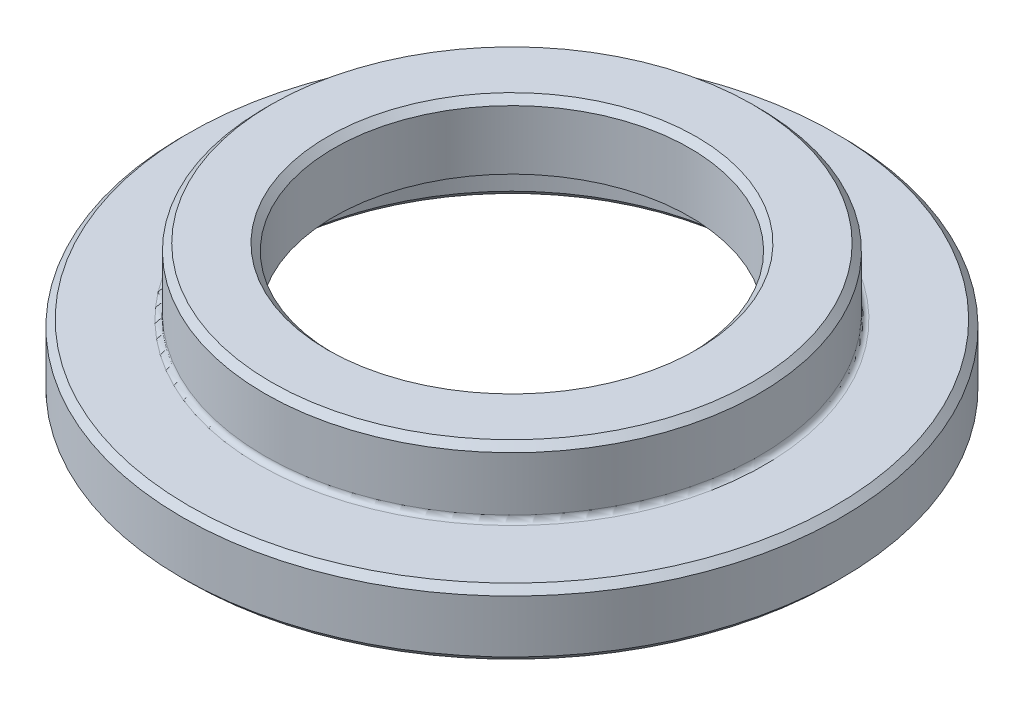
ISO-10303-21;
HEADER;
FILE_DESCRIPTION(('STEP AP214'),'2;1');
FILE_NAME('part.step','',(''),(''),'','','');
FILE_SCHEMA(('AUTOMOTIVE_DESIGN { 1 0 10303 214 1 1 1 1 }'));
ENDSEC;
DATA;
#1=APPLICATION_CONTEXT('core data for automotive mechanical design processes');
#2=APPLICATION_PROTOCOL_DEFINITION('international standard','automotive_design',2000,#1);
#3=PRODUCT_CONTEXT('',#1,'mechanical');
#4=PRODUCT('Part','Part','',(#3));
#5=PRODUCT_RELATED_PRODUCT_CATEGORY('part','',(#4));
#6=PRODUCT_DEFINITION_FORMATION('','',#4);
#7=PRODUCT_DEFINITION_CONTEXT('part definition',#1,'design');
#8=PRODUCT_DEFINITION('design','',#6,#7);
#9=PRODUCT_DEFINITION_SHAPE('','',#8);
#10=(LENGTH_UNIT() NAMED_UNIT(*) SI_UNIT(.MILLI.,.METRE.));
#11=(NAMED_UNIT(*) PLANE_ANGLE_UNIT() SI_UNIT($,.RADIAN.));
#12=(NAMED_UNIT(*) SI_UNIT($,.STERADIAN.) SOLID_ANGLE_UNIT());
#13=UNCERTAINTY_MEASURE_WITH_UNIT(LENGTH_MEASURE(1.E-05),#10,'distance_accuracy_value','');
#14=(GEOMETRIC_REPRESENTATION_CONTEXT(3) GLOBAL_UNCERTAINTY_ASSIGNED_CONTEXT((#13)) GLOBAL_UNIT_ASSIGNED_CONTEXT((#10,
#11,#12)) REPRESENTATION_CONTEXT('',''));
#15=CARTESIAN_POINT('',(0.,0.,0.));
#16=DIRECTION('',(0.,0.,1.));
#17=DIRECTION('',(1.,0.,0.));
#18=AXIS2_PLACEMENT_3D('',#15,#16,#17);
#19=CARTESIAN_POINT('',(0.,2.54,0.));
#20=DIRECTION('',(0.,-1.,0.));
#21=DIRECTION('',(0.,0.,-1.));
#22=AXIS2_PLACEMENT_3D('',#19,#20,#21);
#23=CYLINDRICAL_SURFACE('',#22,9.2837);
#24=CARTESIAN_POINT('',(0.,0.254000000000009,0.));
#25=DIRECTION('',(0.,1.,0.));
#26=DIRECTION('',(0.,0.,1.));
#27=AXIS2_PLACEMENT_3D('',#24,#25,#26);
#28=CIRCLE('',#27,9.2837);
#29=CARTESIAN_POINT('',(0.,0.254000000000009,9.2837));
#30=VERTEX_POINT('',#29);
#31=EDGE_CURVE('E82',#30,#30,#28,.F.);
#32=ORIENTED_EDGE('',*,*,#31,.T.);
#33=EDGE_LOOP('',(#32));
#34=FACE_BOUND('',#33,.T.);
#35=CARTESIAN_POINT('',(0.,2.3368,0.));
#36=DIRECTION('',(0.,1.,0.));
#37=DIRECTION('',(0.,0.,1.));
#38=AXIS2_PLACEMENT_3D('',#35,#36,#37);
#39=CIRCLE('',#38,9.2837);
#40=CARTESIAN_POINT('',(0.,2.3368,9.2837));
#41=VERTEX_POINT('',#40);
#42=EDGE_CURVE('E114',#41,#41,#39,.T.);
#43=ORIENTED_EDGE('',*,*,#42,.T.);
#44=EDGE_LOOP('',(#43));
#45=FACE_BOUND('',#44,.T.);
#46=ADVANCED_FACE('F53',(#34,#45),#23,.F.);
#47=CARTESIAN_POINT('',(0.,2.54,0.));
#48=DIRECTION('',(0.,-1.,0.));
#49=DIRECTION('',(0.,0.,-1.));
#50=AXIS2_PLACEMENT_3D('',#47,#48,#49);
#51=CYLINDRICAL_SURFACE('',#50,12.7);
#52=CARTESIAN_POINT('',(0.,0.254000000000001,0.));
#53=DIRECTION('',(0.,1.,0.));
#54=DIRECTION('',(0.,0.,1.));
#55=AXIS2_PLACEMENT_3D('',#52,#53,#54);
#56=CIRCLE('',#55,12.7);
#57=CARTESIAN_POINT('',(0.,0.254000000000001,12.7));
#58=VERTEX_POINT('',#57);
#59=EDGE_CURVE('E94',#58,#58,#56,.T.);
#60=ORIENTED_EDGE('',*,*,#59,.T.);
#61=EDGE_LOOP('',(#60));
#62=FACE_BOUND('',#61,.T.);
#63=CARTESIAN_POINT('',(0.,2.286,0.));
#64=DIRECTION('',(0.,1.,0.));
#65=DIRECTION('',(0.,0.,1.));
#66=AXIS2_PLACEMENT_3D('',#63,#64,#65);
#67=CIRCLE('',#66,12.7);
#68=CARTESIAN_POINT('',(0.,2.286,12.7));
#69=VERTEX_POINT('',#68);
#70=EDGE_CURVE('E98',#69,#69,#67,.F.);
#71=ORIENTED_EDGE('',*,*,#70,.T.);
#72=EDGE_LOOP('',(#71));
#73=FACE_BOUND('',#72,.T.);
#74=ADVANCED_FACE('F143',(#62,#73),#51,.T.);
#75=CARTESIAN_POINT('',(0.,2.54,0.));
#76=DIRECTION('',(0.,1.,0.));
#77=DIRECTION('',(0.,0.,1.));
#78=AXIS2_PLACEMENT_3D('',#75,#76,#77);
#79=PLANE('',#78);
#80=CARTESIAN_POINT('',(0.,2.54,0.));
#81=DIRECTION('',(0.,1.,0.));
#82=DIRECTION('',(0.,0.,1.));
#83=AXIS2_PLACEMENT_3D('',#80,#81,#82);
#84=CIRCLE('',#83,12.446);
#85=CARTESIAN_POINT('',(0.,2.54,12.446));
#86=VERTEX_POINT('',#85);
#87=EDGE_CURVE('E11',#86,#86,#84,.T.);
#88=ORIENTED_EDGE('',*,*,#87,.T.);
#89=EDGE_LOOP('',(#88));
#90=FACE_BOUND('',#89,.T.);
#91=CARTESIAN_POINT('',(0.,2.54,0.));
#92=DIRECTION('',(0.,1.,0.));
#93=DIRECTION('',(0.,0.,1.));
#94=AXIS2_PLACEMENT_3D('',#91,#92,#93);
#95=CIRCLE('',#94,9.7282);
#96=CARTESIAN_POINT('',(0.,2.54,9.7282));
#97=VERTEX_POINT('',#96);
#98=EDGE_CURVE('E102',#97,#97,#95,.F.);
#99=ORIENTED_EDGE('',*,*,#98,.T.);
#100=EDGE_LOOP('',(#99));
#101=FACE_BOUND('',#100,.T.);
#102=ADVANCED_FACE('F150',(#90,#101),#79,.T.);
#103=CARTESIAN_POINT('',(0.,0.,0.));
#104=DIRECTION('',(0.,1.,0.));
#105=DIRECTION('',(0.,0.,1.));
#106=AXIS2_PLACEMENT_3D('',#103,#104,#105);
#107=PLANE('',#106);
#108=CARTESIAN_POINT('',(0.,0.,0.));
#109=DIRECTION('',(0.,1.,0.));
#110=DIRECTION('',(0.,0.,1.));
#111=AXIS2_PLACEMENT_3D('',#108,#109,#110);
#112=CIRCLE('',#111,12.446);
#113=CARTESIAN_POINT('',(0.,0.,12.446));
#114=VERTEX_POINT('',#113);
#115=EDGE_CURVE('E86',#114,#114,#112,.F.);
#116=ORIENTED_EDGE('',*,*,#115,.T.);
#117=EDGE_LOOP('',(#116));
#118=FACE_BOUND('',#117,.T.);
#119=CARTESIAN_POINT('',(0.,0.,0.));
#120=DIRECTION('',(0.,1.,0.));
#121=DIRECTION('',(0.,0.,1.));
#122=AXIS2_PLACEMENT_3D('',#119,#120,#121);
#123=CIRCLE('',#122,9.5377);
#124=CARTESIAN_POINT('',(0.,0.,9.5377));
#125=VERTEX_POINT('',#124);
#126=EDGE_CURVE('E90',#125,#125,#123,.T.);
#127=ORIENTED_EDGE('',*,*,#126,.T.);
#128=EDGE_LOOP('',(#127));
#129=FACE_BOUND('',#128,.T.);
#130=ADVANCED_FACE('F198',(#118,#129),#107,.F.);
#131=CARTESIAN_POINT('',(0.,2.54,0.));
#132=DIRECTION('',(0.,1.,0.));
#133=DIRECTION('',(0.,0.,1.));
#134=AXIS2_PLACEMENT_3D('',#131,#132,#133);
#135=PLANE('',#134);
#136=CARTESIAN_POINT('',(0.,2.54,0.));
#137=DIRECTION('',(0.,1.,0.));
#138=DIRECTION('',(0.,0.,1.));
#139=AXIS2_PLACEMENT_3D('',#136,#137,#138);
#140=CIRCLE('',#139,9.0805);
#141=CARTESIAN_POINT('',(0.,2.54,9.0805));
#142=VERTEX_POINT('',#141);
#143=EDGE_CURVE('E110',#142,#142,#140,.F.);
#144=ORIENTED_EDGE('',*,*,#143,.T.);
#145=EDGE_LOOP('',(#144));
#146=FACE_BOUND('',#145,.T.);
#147=CARTESIAN_POINT('',(0.,2.54,0.));
#148=DIRECTION('',(0.,1.,0.));
#149=DIRECTION('',(0.,0.,1.));
#150=AXIS2_PLACEMENT_3D('',#147,#148,#149);
#151=CIRCLE('',#150,6.858);
#152=CARTESIAN_POINT('',(0.,2.54,6.858));
#153=VERTEX_POINT('',#152);
#154=EDGE_CURVE('E118',#153,#153,#151,.T.);
#155=ORIENTED_EDGE('',*,*,#154,.T.);
#156=EDGE_LOOP('',(#155));
#157=FACE_BOUND('',#156,.T.);
#158=ADVANCED_FACE('F123',(#146,#157),#135,.F.);
#159=CARTESIAN_POINT('',(0.,5.08,0.));
#160=DIRECTION('',(0.,1.,0.));
#161=DIRECTION('',(0.,0.,1.));
#162=AXIS2_PLACEMENT_3D('',#159,#160,#161);
#163=PLANE('',#162);
#164=CARTESIAN_POINT('',(0.,5.08,0.));
#165=DIRECTION('',(0.,1.,0.));
#166=DIRECTION('',(0.,0.,1.));
#167=AXIS2_PLACEMENT_3D('',#164,#165,#166);
#168=CIRCLE('',#167,7.112);
#169=CARTESIAN_POINT('',(0.,5.08,7.112));
#170=VERTEX_POINT('',#169);
#171=EDGE_CURVE('E67',#170,#170,#168,.F.);
#172=ORIENTED_EDGE('',*,*,#171,.T.);
#173=EDGE_LOOP('',(#172));
#174=FACE_BOUND('',#173,.T.);
#175=CARTESIAN_POINT('',(0.,5.08,0.));
#176=DIRECTION('',(0.,1.,0.));
#177=DIRECTION('',(0.,0.,1.));
#178=AXIS2_PLACEMENT_3D('',#175,#176,#177);
#179=CIRCLE('',#178,9.271);
#180=CARTESIAN_POINT('',(0.,5.08,9.271));
#181=VERTEX_POINT('',#180);
#182=EDGE_CURVE('E72',#181,#181,#179,.T.);
#183=ORIENTED_EDGE('',*,*,#182,.T.);
#184=EDGE_LOOP('',(#183));
#185=FACE_BOUND('',#184,.T.);
#186=ADVANCED_FACE('F139',(#174,#185),#163,.T.);
#187=CARTESIAN_POINT('',(0.,5.08,0.));
#188=DIRECTION('',(0.,-1.,0.));
#189=DIRECTION('',(0.,0.,-1.));
#190=AXIS2_PLACEMENT_3D('',#187,#188,#189);
#191=CYLINDRICAL_SURFACE('',#190,9.525);
#192=CARTESIAN_POINT('',(0.,4.82599999999999,0.));
#193=DIRECTION('',(0.,1.,0.));
#194=DIRECTION('',(0.,0.,1.));
#195=AXIS2_PLACEMENT_3D('',#192,#193,#194);
#196=CIRCLE('',#195,9.525);
#197=CARTESIAN_POINT('',(0.,4.82599999999999,9.525));
#198=VERTEX_POINT('',#197);
#199=EDGE_CURVE('E62',#198,#198,#196,.F.);
#200=ORIENTED_EDGE('',*,*,#199,.T.);
#201=EDGE_LOOP('',(#200));
#202=FACE_BOUND('',#201,.T.);
#203=CARTESIAN_POINT('',(0.,2.7432,0.));
#204=DIRECTION('',(0.,1.,0.));
#205=DIRECTION('',(0.,0.,1.));
#206=AXIS2_PLACEMENT_3D('',#203,#204,#205);
#207=CIRCLE('',#206,9.525);
#208=CARTESIAN_POINT('',(0.,2.7432,9.525));
#209=VERTEX_POINT('',#208);
#210=EDGE_CURVE('E106',#209,#209,#207,.T.);
#211=ORIENTED_EDGE('',*,*,#210,.T.);
#212=EDGE_LOOP('',(#211));
#213=FACE_BOUND('',#212,.T.);
#214=ADVANCED_FACE('F128',(#202,#213),#191,.T.);
#215=CARTESIAN_POINT('',(0.,5.08,0.));
#216=DIRECTION('',(0.,-1.,0.));
#217=DIRECTION('',(0.,0.,-1.));
#218=AXIS2_PLACEMENT_3D('',#215,#216,#217);
#219=CYLINDRICAL_SURFACE('',#218,6.858);
#220=CARTESIAN_POINT('',(0.,4.826,0.));
#221=DIRECTION('',(0.,1.,0.));
#222=DIRECTION('',(0.,0.,1.));
#223=AXIS2_PLACEMENT_3D('',#220,#221,#222);
#224=CIRCLE('',#223,6.858);
#225=CARTESIAN_POINT('',(0.,4.826,6.858));
#226=VERTEX_POINT('',#225);
#227=EDGE_CURVE('E78',#226,#226,#224,.T.);
#228=ORIENTED_EDGE('',*,*,#227,.T.);
#229=EDGE_LOOP('',(#228));
#230=FACE_BOUND('',#229,.T.);
#231=ORIENTED_EDGE('',*,*,#154,.F.);
#232=EDGE_LOOP('',(#231));
#233=FACE_BOUND('',#232,.T.);
#234=ADVANCED_FACE('F125',(#230,#233),#219,.F.);
#235=CARTESIAN_POINT('',(0.,2.3368,0.));
#236=DIRECTION('',(0.,1.,0.));
#237=DIRECTION('',(0.,0.,1.));
#238=AXIS2_PLACEMENT_3D('',#235,#236,#237);
#239=TOROIDAL_SURFACE('',#238,9.0805,0.2032);
#240=ORIENTED_EDGE('',*,*,#143,.F.);
#241=EDGE_LOOP('',(#240));
#242=FACE_BOUND('',#241,.T.);
#243=ORIENTED_EDGE('',*,*,#42,.F.);
#244=EDGE_LOOP('',(#243));
#245=FACE_BOUND('',#244,.T.);
#246=ADVANCED_FACE('F127',(#242,#245),#239,.F.);
#247=CARTESIAN_POINT('',(0.,2.7432,0.));
#248=DIRECTION('',(0.,1.,0.));
#249=DIRECTION('',(0.,0.,1.));
#250=AXIS2_PLACEMENT_3D('',#247,#248,#249);
#251=TOROIDAL_SURFACE('',#250,9.7282,0.2032);
#252=ORIENTED_EDGE('',*,*,#98,.F.);
#253=EDGE_LOOP('',(#252));
#254=FACE_BOUND('',#253,.T.);
#255=ORIENTED_EDGE('',*,*,#210,.F.);
#256=EDGE_LOOP('',(#255));
#257=FACE_BOUND('',#256,.T.);
#258=ADVANCED_FACE('F136',(#254,#257),#251,.F.);
#259=CARTESIAN_POINT('',(0.,0.254000000000001,0.));
#260=DIRECTION('',(0.,1.,0.));
#261=DIRECTION('',(0.,0.,1.));
#262=AXIS2_PLACEMENT_3D('',#259,#260,#261);
#263=CONICAL_SURFACE('',#262,12.7,0.785398163397445);
#264=ORIENTED_EDGE('',*,*,#115,.F.);
#265=EDGE_LOOP('',(#264));
#266=FACE_BOUND('',#265,.T.);
#267=ORIENTED_EDGE('',*,*,#59,.F.);
#268=EDGE_LOOP('',(#267));
#269=FACE_BOUND('',#268,.T.);
#270=ADVANCED_FACE('F158',(#266,#269),#263,.T.);
#271=CARTESIAN_POINT('',(0.,0.,0.));
#272=DIRECTION('',(0.,-1.,0.));
#273=DIRECTION('',(0.,0.,-1.));
#274=AXIS2_PLACEMENT_3D('',#271,#272,#273);
#275=CONICAL_SURFACE('',#274,9.5377,0.785398163397438);
#276=ORIENTED_EDGE('',*,*,#31,.F.);
#277=EDGE_LOOP('',(#276));
#278=FACE_BOUND('',#277,.T.);
#279=ORIENTED_EDGE('',*,*,#126,.F.);
#280=EDGE_LOOP('',(#279));
#281=FACE_BOUND('',#280,.T.);
#282=ADVANCED_FACE('F166',(#278,#281),#275,.F.);
#283=CARTESIAN_POINT('',(0.,4.826,0.));
#284=DIRECTION('',(0.,1.,0.));
#285=DIRECTION('',(0.,0.,1.));
#286=AXIS2_PLACEMENT_3D('',#283,#284,#285);
#287=CONICAL_SURFACE('',#286,6.858,0.785398163397464);
#288=ORIENTED_EDGE('',*,*,#171,.F.);
#289=EDGE_LOOP('',(#288));
#290=FACE_BOUND('',#289,.T.);
#291=ORIENTED_EDGE('',*,*,#227,.F.);
#292=EDGE_LOOP('',(#291));
#293=FACE_BOUND('',#292,.T.);
#294=ADVANCED_FACE('F173',(#290,#293),#287,.F.);
#295=CARTESIAN_POINT('',(0.,5.08,0.));
#296=DIRECTION('',(0.,-1.,0.));
#297=DIRECTION('',(0.,0.,-1.));
#298=AXIS2_PLACEMENT_3D('',#295,#296,#297);
#299=CONICAL_SURFACE('',#298,9.271,0.785398163397442);
#300=ORIENTED_EDGE('',*,*,#199,.F.);
#301=EDGE_LOOP('',(#300));
#302=FACE_BOUND('',#301,.T.);
#303=ORIENTED_EDGE('',*,*,#182,.F.);
#304=EDGE_LOOP('',(#303));
#305=FACE_BOUND('',#304,.T.);
#306=ADVANCED_FACE('F179',(#302,#305),#299,.T.);
#307=CARTESIAN_POINT('',(0.,2.54,0.));
#308=DIRECTION('',(0.,-1.,0.));
#309=DIRECTION('',(0.,0.,-1.));
#310=AXIS2_PLACEMENT_3D('',#307,#308,#309);
#311=CONICAL_SURFACE('',#310,12.446,0.785398163397448);
#312=ORIENTED_EDGE('',*,*,#70,.F.);
#313=EDGE_LOOP('',(#312));
#314=FACE_BOUND('',#313,.T.);
#315=ORIENTED_EDGE('',*,*,#87,.F.);
#316=EDGE_LOOP('',(#315));
#317=FACE_BOUND('',#316,.T.);
#318=ADVANCED_FACE('F56',(#314,#317),#311,.T.);
#319=CLOSED_SHELL('',(#46,#74,#102,#130,#158,#186,#214,#234,#246,#258,#270,#282,#294,#306,#318));
#320=MANIFOLD_SOLID_BREP('B2',#319);
#321=ADVANCED_BREP_SHAPE_REPRESENTATION('',(#18,#320),#14);
#322=SHAPE_DEFINITION_REPRESENTATION(#9,#321);
ENDSEC;
END-ISO-10303-21;
